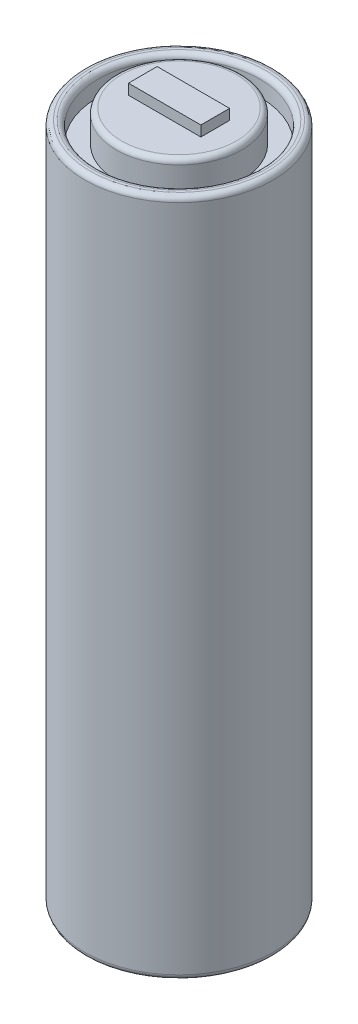
ISO-10303-21;
HEADER;
FILE_DESCRIPTION(('STEP AP214'),'2;1');
FILE_NAME('part.step','',(''),(''),'','','');
FILE_SCHEMA(('AUTOMOTIVE_DESIGN { 1 0 10303 214 1 1 1 1 }'));
ENDSEC;
DATA;
#1=APPLICATION_CONTEXT('core data for automotive mechanical design processes');
#2=APPLICATION_PROTOCOL_DEFINITION('international standard','automotive_design',2000,#1);
#3=PRODUCT_CONTEXT('',#1,'mechanical');
#4=PRODUCT('Part','Part','',(#3));
#5=PRODUCT_RELATED_PRODUCT_CATEGORY('part','',(#4));
#6=PRODUCT_DEFINITION_FORMATION('','',#4);
#7=PRODUCT_DEFINITION_CONTEXT('part definition',#1,'design');
#8=PRODUCT_DEFINITION('design','',#6,#7);
#9=PRODUCT_DEFINITION_SHAPE('','',#8);
#10=(LENGTH_UNIT() NAMED_UNIT(*) SI_UNIT(.MILLI.,.METRE.));
#11=(NAMED_UNIT(*) PLANE_ANGLE_UNIT() SI_UNIT($,.RADIAN.));
#12=(NAMED_UNIT(*) SI_UNIT($,.STERADIAN.) SOLID_ANGLE_UNIT());
#13=UNCERTAINTY_MEASURE_WITH_UNIT(LENGTH_MEASURE(1.E-05),#10,'distance_accuracy_value','');
#14=(GEOMETRIC_REPRESENTATION_CONTEXT(3) GLOBAL_UNCERTAINTY_ASSIGNED_CONTEXT((#13)) GLOBAL_UNIT_ASSIGNED_CONTEXT((#10,
#11,#12)) REPRESENTATION_CONTEXT('',''));
#15=CARTESIAN_POINT('',(0.,0.,0.));
#16=DIRECTION('',(0.,0.,1.));
#17=DIRECTION('',(1.,0.,0.));
#18=AXIS2_PLACEMENT_3D('',#15,#16,#17);
#19=CARTESIAN_POINT('',(0.,66.,0.));
#20=DIRECTION('',(0.,1.,0.));
#21=DIRECTION('',(0.,0.,1.));
#22=AXIS2_PLACEMENT_3D('',#19,#20,#21);
#23=PLANE('',#22);
#24=CARTESIAN_POINT('',(0.,66.,0.));
#25=DIRECTION('',(0.,1.,0.));
#26=DIRECTION('',(0.,0.,1.));
#27=AXIS2_PLACEMENT_3D('',#24,#25,#26);
#28=CIRCLE('',#27,5.5);
#29=CARTESIAN_POINT('',(0.,66.,5.5));
#30=VERTEX_POINT('',#29);
#31=EDGE_CURVE('E165',#30,#30,#28,.T.);
#32=ORIENTED_EDGE('',*,*,#31,.T.);
#33=EDGE_LOOP('',(#32));
#34=FACE_BOUND('',#33,.T.);
#35=DIRECTION('',(1.,0.,0.));
#36=VECTOR('',#35,1.);
#37=CARTESIAN_POINT('',(3.46645993403452,66.,1.37585131009472));
#38=LINE('',#37,#36);
#39=CARTESIAN_POINT('',(-3.46645993403452,66.,1.37585131009472));
#40=VERTEX_POINT('',#39);
#41=CARTESIAN_POINT('',(3.46645993403452,66.,1.37585131009472));
#42=VERTEX_POINT('',#41);
#43=EDGE_CURVE('E338',#40,#42,#38,.T.);
#44=ORIENTED_EDGE('',*,*,#43,.F.);
#45=DIRECTION('',(0.,0.,1.));
#46=VECTOR('',#45,1.);
#47=CARTESIAN_POINT('',(-3.46645993403452,66.,1.37585131009472));
#48=LINE('',#47,#46);
#49=CARTESIAN_POINT('',(-3.46645993403452,66.,-1.37585131009472));
#50=VERTEX_POINT('',#49);
#51=EDGE_CURVE('E123',#50,#40,#48,.T.);
#52=ORIENTED_EDGE('',*,*,#51,.F.);
#53=DIRECTION('',(-1.,0.,0.));
#54=VECTOR('',#53,1.);
#55=CARTESIAN_POINT('',(-3.46645993403452,66.,-1.37585131009472));
#56=LINE('',#55,#54);
#57=CARTESIAN_POINT('',(3.46645993403453,66.,-1.37585131009472));
#58=VERTEX_POINT('',#57);
#59=EDGE_CURVE('E119',#58,#50,#56,.T.);
#60=ORIENTED_EDGE('',*,*,#59,.F.);
#61=DIRECTION('',(0.,0.,-1.));
#62=VECTOR('',#61,1.);
#63=CARTESIAN_POINT('',(3.46645993403453,66.,-1.37585131009472));
#64=LINE('',#63,#62);
#65=EDGE_CURVE('E335',#42,#58,#64,.T.);
#66=ORIENTED_EDGE('',*,*,#65,.F.);
#67=EDGE_LOOP('',(#44,#52,#60,#66));
#68=FACE_BOUND('',#67,.T.);
#69=ADVANCED_FACE('F35',(#34,#68),#23,.T.);
#70=CARTESIAN_POINT('',(0.,0.,0.));
#71=DIRECTION('',(0.,1.,0.));
#72=DIRECTION('',(0.,0.,1.));
#73=AXIS2_PLACEMENT_3D('',#70,#71,#72);
#74=PLANE('',#73);
#75=CARTESIAN_POINT('',(0.,0.,0.));
#76=DIRECTION('',(0.,1.,0.));
#77=DIRECTION('',(0.,0.,1.));
#78=AXIS2_PLACEMENT_3D('',#75,#76,#77);
#79=CIRCLE('',#78,8.5);
#80=CARTESIAN_POINT('',(0.,0.,8.5));
#81=VERTEX_POINT('',#80);
#82=EDGE_CURVE('E43',#81,#81,#79,.F.);
#83=ORIENTED_EDGE('',*,*,#82,.T.);
#84=EDGE_LOOP('',(#83));
#85=FACE_BOUND('',#84,.T.);
#86=DIRECTION('',(0.,0.,-1.));
#87=VECTOR('',#86,1.);
#88=CARTESIAN_POINT('',(-3.46645993403452,0.,1.37585131009472));
#89=LINE('',#88,#87);
#90=CARTESIAN_POINT('',(-3.46645993403452,0.,1.37585131009472));
#91=VERTEX_POINT('',#90);
#92=CARTESIAN_POINT('',(-3.46645993403452,0.,-1.37585131009472));
#93=VERTEX_POINT('',#92);
#94=EDGE_CURVE('E125',#91,#93,#89,.T.);
#95=ORIENTED_EDGE('',*,*,#94,.F.);
#96=DIRECTION('',(-1.,0.,0.));
#97=VECTOR('',#96,1.);
#98=CARTESIAN_POINT('',(-3.46645993403452,0.,1.37585131009472));
#99=LINE('',#98,#97);
#100=CARTESIAN_POINT('',(3.46645993403452,0.,1.37585131009472));
#101=VERTEX_POINT('',#100);
#102=EDGE_CURVE('E136',#101,#91,#99,.T.);
#103=ORIENTED_EDGE('',*,*,#102,.F.);
#104=DIRECTION('',(0.,0.,1.));
#105=VECTOR('',#104,1.);
#106=CARTESIAN_POINT('',(3.46645993403452,0.,1.37585131009472));
#107=LINE('',#106,#105);
#108=CARTESIAN_POINT('',(3.46645993403453,0.,-1.37585131009472));
#109=VERTEX_POINT('',#108);
#110=EDGE_CURVE('E144',#109,#101,#107,.T.);
#111=ORIENTED_EDGE('',*,*,#110,.F.);
#112=DIRECTION('',(1.,0.,0.));
#113=VECTOR('',#112,1.);
#114=CARTESIAN_POINT('',(-3.46645993403452,0.,-1.37585131009472));
#115=LINE('',#114,#113);
#116=EDGE_CURVE('E58',#93,#109,#115,.T.);
#117=ORIENTED_EDGE('',*,*,#116,.F.);
#118=EDGE_LOOP('',(#95,#103,#111,#117));
#119=FACE_BOUND('',#118,.T.);
#120=ADVANCED_FACE('F185',(#85,#119),#74,.F.);
#121=CARTESIAN_POINT('',(0.,65.,0.));
#122=DIRECTION('',(0.,-1.,0.));
#123=DIRECTION('',(0.,0.,-1.));
#124=AXIS2_PLACEMENT_3D('',#121,#122,#123);
#125=CYLINDRICAL_SURFACE('',#124,9.);
#126=CARTESIAN_POINT('',(0.,64.5,0.));
#127=DIRECTION('',(0.,1.,0.));
#128=DIRECTION('',(0.,0.,1.));
#129=AXIS2_PLACEMENT_3D('',#126,#127,#128);
#130=CIRCLE('',#129,9.);
#131=CARTESIAN_POINT('',(0.,64.5,9.));
#132=VERTEX_POINT('',#131);
#133=EDGE_CURVE('E180',#132,#132,#130,.F.);
#134=ORIENTED_EDGE('',*,*,#133,.T.);
#135=EDGE_LOOP('',(#134));
#136=FACE_BOUND('',#135,.T.);
#137=CARTESIAN_POINT('',(0.,0.5,0.));
#138=DIRECTION('',(0.,1.,0.));
#139=DIRECTION('',(0.,0.,1.));
#140=AXIS2_PLACEMENT_3D('',#137,#138,#139);
#141=CIRCLE('',#140,9.);
#142=CARTESIAN_POINT('',(0.,0.5,9.));
#143=VERTEX_POINT('',#142);
#144=EDGE_CURVE('E177',#143,#143,#141,.T.);
#145=ORIENTED_EDGE('',*,*,#144,.T.);
#146=EDGE_LOOP('',(#145));
#147=FACE_BOUND('',#146,.T.);
#148=ADVANCED_FACE('F193',(#136,#147),#125,.T.);
#149=CARTESIAN_POINT('',(0.,65.,0.));
#150=DIRECTION('',(0.,1.,0.));
#151=DIRECTION('',(0.,0.,1.));
#152=AXIS2_PLACEMENT_3D('',#149,#150,#151);
#153=PLANE('',#152);
#154=CARTESIAN_POINT('',(0.,65.,0.));
#155=DIRECTION('',(0.,1.,0.));
#156=DIRECTION('',(0.,0.,1.));
#157=AXIS2_PLACEMENT_3D('',#154,#155,#156);
#158=CIRCLE('',#157,8.5);
#159=CARTESIAN_POINT('',(0.,65.,8.5));
#160=VERTEX_POINT('',#159);
#161=EDGE_CURVE('E174',#160,#160,#158,.T.);
#162=ORIENTED_EDGE('',*,*,#161,.T.);
#163=EDGE_LOOP('',(#162));
#164=FACE_BOUND('',#163,.T.);
#165=CARTESIAN_POINT('',(0.,65.,0.));
#166=DIRECTION('',(0.,1.,0.));
#167=DIRECTION('',(0.,0.,1.));
#168=AXIS2_PLACEMENT_3D('',#165,#166,#167);
#169=CIRCLE('',#168,8.25);
#170=CARTESIAN_POINT('',(0.,65.,8.25));
#171=VERTEX_POINT('',#170);
#172=EDGE_CURVE('E171',#171,#171,#169,.F.);
#173=ORIENTED_EDGE('',*,*,#172,.T.);
#174=EDGE_LOOP('',(#173));
#175=FACE_BOUND('',#174,.T.);
#176=ADVANCED_FACE('F195',(#164,#175),#153,.T.);
#177=CARTESIAN_POINT('',(0.,63.,0.));
#178=DIRECTION('',(0.,1.,0.));
#179=DIRECTION('',(0.,0.,1.));
#180=AXIS2_PLACEMENT_3D('',#177,#178,#179);
#181=CYLINDRICAL_SURFACE('',#180,7.75);
#182=CARTESIAN_POINT('',(0.,64.5,0.));
#183=DIRECTION('',(0.,1.,0.));
#184=DIRECTION('',(0.,0.,1.));
#185=AXIS2_PLACEMENT_3D('',#182,#183,#184);
#186=CIRCLE('',#185,7.75);
#187=CARTESIAN_POINT('',(0.,64.5,7.75));
#188=VERTEX_POINT('',#187);
#189=EDGE_CURVE('E11',#188,#188,#186,.T.);
#190=ORIENTED_EDGE('',*,*,#189,.T.);
#191=EDGE_LOOP('',(#190));
#192=FACE_BOUND('',#191,.T.);
#193=CARTESIAN_POINT('',(0.,63.,0.));
#194=DIRECTION('',(0.,1.,0.));
#195=DIRECTION('',(0.,0.,1.));
#196=AXIS2_PLACEMENT_3D('',#193,#194,#195);
#197=CIRCLE('',#196,7.75);
#198=CARTESIAN_POINT('',(0.,63.,7.75));
#199=VERTEX_POINT('',#198);
#200=EDGE_CURVE('E162',#199,#199,#197,.T.);
#201=ORIENTED_EDGE('',*,*,#200,.F.);
#202=EDGE_LOOP('',(#201));
#203=FACE_BOUND('',#202,.T.);
#204=ADVANCED_FACE('F202',(#192,#203),#181,.F.);
#205=CARTESIAN_POINT('',(0.,63.,0.));
#206=DIRECTION('',(0.,1.,0.));
#207=DIRECTION('',(0.,0.,1.));
#208=AXIS2_PLACEMENT_3D('',#205,#206,#207);
#209=PLANE('',#208);
#210=CARTESIAN_POINT('',(0.,63.,0.));
#211=DIRECTION('',(0.,1.,0.));
#212=DIRECTION('',(0.,0.,1.));
#213=AXIS2_PLACEMENT_3D('',#210,#211,#212);
#214=CIRCLE('',#213,6.);
#215=CARTESIAN_POINT('',(0.,63.,6.));
#216=VERTEX_POINT('',#215);
#217=EDGE_CURVE('E159',#216,#216,#214,.T.);
#218=ORIENTED_EDGE('',*,*,#217,.F.);
#219=EDGE_LOOP('',(#218));
#220=FACE_BOUND('',#219,.T.);
#221=ORIENTED_EDGE('',*,*,#200,.T.);
#222=EDGE_LOOP('',(#221));
#223=FACE_BOUND('',#222,.T.);
#224=ADVANCED_FACE('F221',(#220,#223),#209,.T.);
#225=CARTESIAN_POINT('',(0.,63.,0.));
#226=DIRECTION('',(0.,1.,0.));
#227=DIRECTION('',(0.,0.,1.));
#228=AXIS2_PLACEMENT_3D('',#225,#226,#227);
#229=CYLINDRICAL_SURFACE('',#228,6.);
#230=CARTESIAN_POINT('',(0.,65.5,0.));
#231=DIRECTION('',(0.,1.,0.));
#232=DIRECTION('',(0.,0.,1.));
#233=AXIS2_PLACEMENT_3D('',#230,#231,#232);
#234=CIRCLE('',#233,6.);
#235=CARTESIAN_POINT('',(0.,65.5,6.));
#236=VERTEX_POINT('',#235);
#237=EDGE_CURVE('E168',#236,#236,#234,.F.);
#238=ORIENTED_EDGE('',*,*,#237,.T.);
#239=EDGE_LOOP('',(#238));
#240=FACE_BOUND('',#239,.T.);
#241=ORIENTED_EDGE('',*,*,#217,.T.);
#242=EDGE_LOOP('',(#241));
#243=FACE_BOUND('',#242,.T.);
#244=ADVANCED_FACE('F217',(#240,#243),#229,.T.);
#245=CARTESIAN_POINT('',(0.,65.5,0.));
#246=DIRECTION('',(0.,1.,0.));
#247=DIRECTION('',(0.,0.,1.));
#248=AXIS2_PLACEMENT_3D('',#245,#246,#247);
#249=TOROIDAL_SURFACE('',#248,5.5,0.5);
#250=ORIENTED_EDGE('',*,*,#237,.F.);
#251=EDGE_LOOP('',(#250));
#252=FACE_BOUND('',#251,.T.);
#253=ORIENTED_EDGE('',*,*,#31,.F.);
#254=EDGE_LOOP('',(#253));
#255=FACE_BOUND('',#254,.T.);
#256=ADVANCED_FACE('F220',(#252,#255),#249,.T.);
#257=CARTESIAN_POINT('',(0.,64.5,0.));
#258=DIRECTION('',(0.,1.,0.));
#259=DIRECTION('',(0.,0.,1.));
#260=AXIS2_PLACEMENT_3D('',#257,#258,#259);
#261=TOROIDAL_SURFACE('',#260,8.5,0.5);
#262=ORIENTED_EDGE('',*,*,#133,.F.);
#263=EDGE_LOOP('',(#262));
#264=FACE_BOUND('',#263,.T.);
#265=ORIENTED_EDGE('',*,*,#161,.F.);
#266=EDGE_LOOP('',(#265));
#267=FACE_BOUND('',#266,.T.);
#268=ADVANCED_FACE('F190',(#264,#267),#261,.T.);
#269=CARTESIAN_POINT('',(0.,0.5,0.));
#270=DIRECTION('',(0.,1.,0.));
#271=DIRECTION('',(0.,0.,1.));
#272=AXIS2_PLACEMENT_3D('',#269,#270,#271);
#273=TOROIDAL_SURFACE('',#272,8.5,0.5);
#274=ORIENTED_EDGE('',*,*,#82,.F.);
#275=EDGE_LOOP('',(#274));
#276=FACE_BOUND('',#275,.T.);
#277=ORIENTED_EDGE('',*,*,#144,.F.);
#278=EDGE_LOOP('',(#277));
#279=FACE_BOUND('',#278,.T.);
#280=ADVANCED_FACE('F187',(#276,#279),#273,.T.);
#281=CARTESIAN_POINT('',(0.,64.5,0.));
#282=DIRECTION('',(0.,1.,0.));
#283=DIRECTION('',(0.,0.,1.));
#284=AXIS2_PLACEMENT_3D('',#281,#282,#283);
#285=TOROIDAL_SURFACE('',#284,8.25,0.5);
#286=ORIENTED_EDGE('',*,*,#172,.F.);
#287=EDGE_LOOP('',(#286));
#288=FACE_BOUND('',#287,.T.);
#289=ORIENTED_EDGE('',*,*,#189,.F.);
#290=EDGE_LOOP('',(#289));
#291=FACE_BOUND('',#290,.T.);
#292=ADVANCED_FACE('F37',(#288,#291),#285,.T.);
#293=CARTESIAN_POINT('',(-3.46645993403452,-1.,1.37585131009472));
#294=DIRECTION('',(1.,0.,0.));
#295=DIRECTION('',(0.,0.,-1.));
#296=AXIS2_PLACEMENT_3D('',#293,#294,#295);
#297=PLANE('',#296);
#298=ORIENTED_EDGE('',*,*,#94,.T.);
#299=DIRECTION('',(0.,1.,0.));
#300=VECTOR('',#299,1.);
#301=CARTESIAN_POINT('',(-3.46645993403452,-1.,-1.37585131009472));
#302=LINE('',#301,#300);
#303=CARTESIAN_POINT('',(-3.46645993403452,-1.,-1.37585131009472));
#304=VERTEX_POINT('',#303);
#305=EDGE_CURVE('E157',#304,#93,#302,.T.);
#306=ORIENTED_EDGE('',*,*,#305,.F.);
#307=DIRECTION('',(0.,0.,-1.));
#308=VECTOR('',#307,1.);
#309=CARTESIAN_POINT('',(-3.46645993403452,-1.,1.37585131009472));
#310=LINE('',#309,#308);
#311=CARTESIAN_POINT('',(-3.46645993403452,-1.,1.37585131009472));
#312=VERTEX_POINT('',#311);
#313=EDGE_CURVE('E132',#312,#304,#310,.T.);
#314=ORIENTED_EDGE('',*,*,#313,.F.);
#315=DIRECTION('',(0.,1.,0.));
#316=VECTOR('',#315,1.);
#317=CARTESIAN_POINT('',(-3.46645993403452,-1.,1.37585131009472));
#318=LINE('',#317,#316);
#319=EDGE_CURVE('E141',#312,#91,#318,.T.);
#320=ORIENTED_EDGE('',*,*,#319,.T.);
#321=EDGE_LOOP('',(#298,#306,#314,#320));
#322=FACE_BOUND('',#321,.T.);
#323=ADVANCED_FACE('F215',(#322),#297,.F.);
#324=CARTESIAN_POINT('',(-3.46645993403452,-1.,-1.37585131009472));
#325=DIRECTION('',(0.,0.,1.));
#326=DIRECTION('',(1.,0.,0.));
#327=AXIS2_PLACEMENT_3D('',#324,#325,#326);
#328=PLANE('',#327);
#329=ORIENTED_EDGE('',*,*,#116,.T.);
#330=DIRECTION('',(0.,1.,0.));
#331=VECTOR('',#330,1.);
#332=CARTESIAN_POINT('',(3.46645993403453,-1.,-1.37585131009472));
#333=LINE('',#332,#331);
#334=CARTESIAN_POINT('',(3.46645993403453,-1.,-1.37585131009472));
#335=VERTEX_POINT('',#334);
#336=EDGE_CURVE('E154',#335,#109,#333,.T.);
#337=ORIENTED_EDGE('',*,*,#336,.F.);
#338=DIRECTION('',(1.,0.,0.));
#339=VECTOR('',#338,1.);
#340=CARTESIAN_POINT('',(-3.46645993403452,-1.,-1.37585131009472));
#341=LINE('',#340,#339);
#342=EDGE_CURVE('E135',#304,#335,#341,.T.);
#343=ORIENTED_EDGE('',*,*,#342,.F.);
#344=ORIENTED_EDGE('',*,*,#305,.T.);
#345=EDGE_LOOP('',(#329,#337,#343,#344));
#346=FACE_BOUND('',#345,.T.);
#347=ADVANCED_FACE('F240',(#346),#328,.F.);
#348=CARTESIAN_POINT('',(3.46645993403452,-1.,1.37585131009472));
#349=DIRECTION('',(-1.,0.,0.));
#350=DIRECTION('',(0.,0.,1.));
#351=AXIS2_PLACEMENT_3D('',#348,#349,#350);
#352=PLANE('',#351);
#353=ORIENTED_EDGE('',*,*,#110,.T.);
#354=DIRECTION('',(0.,1.,0.));
#355=VECTOR('',#354,1.);
#356=CARTESIAN_POINT('',(3.46645993403452,-1.,1.37585131009472));
#357=LINE('',#356,#355);
#358=CARTESIAN_POINT('',(3.46645993403452,-1.,1.37585131009472));
#359=VERTEX_POINT('',#358);
#360=EDGE_CURVE('E151',#359,#101,#357,.T.);
#361=ORIENTED_EDGE('',*,*,#360,.F.);
#362=DIRECTION('',(0.,0.,1.));
#363=VECTOR('',#362,1.);
#364=CARTESIAN_POINT('',(3.46645993403452,-1.,1.37585131009472));
#365=LINE('',#364,#363);
#366=EDGE_CURVE('E138',#335,#359,#365,.T.);
#367=ORIENTED_EDGE('',*,*,#366,.F.);
#368=ORIENTED_EDGE('',*,*,#336,.T.);
#369=EDGE_LOOP('',(#353,#361,#367,#368));
#370=FACE_BOUND('',#369,.T.);
#371=ADVANCED_FACE('F247',(#370),#352,.F.);
#372=CARTESIAN_POINT('',(-3.46645993403452,-1.,1.37585131009472));
#373=DIRECTION('',(0.,0.,-1.));
#374=DIRECTION('',(-1.,0.,0.));
#375=AXIS2_PLACEMENT_3D('',#372,#373,#374);
#376=PLANE('',#375);
#377=ORIENTED_EDGE('',*,*,#102,.T.);
#378=ORIENTED_EDGE('',*,*,#319,.F.);
#379=DIRECTION('',(-1.,0.,0.));
#380=VECTOR('',#379,1.);
#381=CARTESIAN_POINT('',(-3.46645993403452,-1.,1.37585131009472));
#382=LINE('',#381,#380);
#383=EDGE_CURVE('E140',#359,#312,#382,.T.);
#384=ORIENTED_EDGE('',*,*,#383,.F.);
#385=ORIENTED_EDGE('',*,*,#360,.T.);
#386=EDGE_LOOP('',(#377,#378,#384,#385));
#387=FACE_BOUND('',#386,.T.);
#388=ADVANCED_FACE('F253',(#387),#376,.F.);
#389=CARTESIAN_POINT('',(0.,-1.,0.));
#390=DIRECTION('',(0.,-1.,0.));
#391=DIRECTION('',(0.,0.,-1.));
#392=AXIS2_PLACEMENT_3D('',#389,#390,#391);
#393=PLANE('',#392);
#394=ORIENTED_EDGE('',*,*,#313,.T.);
#395=ORIENTED_EDGE('',*,*,#342,.T.);
#396=ORIENTED_EDGE('',*,*,#366,.T.);
#397=ORIENTED_EDGE('',*,*,#383,.T.);
#398=EDGE_LOOP('',(#394,#395,#396,#397));
#399=FACE_BOUND('',#398,.T.);
#400=ADVANCED_FACE('F260',(#399),#393,.T.);
#401=CARTESIAN_POINT('',(-3.46645993403452,67.,1.37585131009472));
#402=DIRECTION('',(1.,0.,0.));
#403=DIRECTION('',(0.,0.,-1.));
#404=AXIS2_PLACEMENT_3D('',#401,#402,#403);
#405=PLANE('',#404);
#406=ORIENTED_EDGE('',*,*,#51,.T.);
#407=DIRECTION('',(0.,-1.,0.));
#408=VECTOR('',#407,1.);
#409=CARTESIAN_POINT('',(-3.46645993403452,67.,1.37585131009472));
#410=LINE('',#409,#408);
#411=CARTESIAN_POINT('',(-3.46645993403452,67.,1.37585131009472));
#412=VERTEX_POINT('',#411);
#413=EDGE_CURVE('E104',#412,#40,#410,.T.);
#414=ORIENTED_EDGE('',*,*,#413,.F.);
#415=DIRECTION('',(0.,0.,1.));
#416=VECTOR('',#415,1.);
#417=CARTESIAN_POINT('',(-3.46645993403452,67.,1.37585131009472));
#418=LINE('',#417,#416);
#419=CARTESIAN_POINT('',(-3.46645993403452,67.,-1.37585131009472));
#420=VERTEX_POINT('',#419);
#421=EDGE_CURVE('E111',#420,#412,#418,.T.);
#422=ORIENTED_EDGE('',*,*,#421,.F.);
#423=DIRECTION('',(0.,-1.,0.));
#424=VECTOR('',#423,1.);
#425=CARTESIAN_POINT('',(-3.46645993403452,67.,-1.37585131009472));
#426=LINE('',#425,#424);
#427=EDGE_CURVE('E333',#420,#50,#426,.T.);
#428=ORIENTED_EDGE('',*,*,#427,.T.);
#429=EDGE_LOOP('',(#406,#414,#422,#428));
#430=FACE_BOUND('',#429,.T.);
#431=ADVANCED_FACE('F121',(#430),#405,.F.);
#432=CARTESIAN_POINT('',(3.46645993403452,67.,1.37585131009472));
#433=DIRECTION('',(0.,0.,-1.));
#434=DIRECTION('',(-1.,0.,0.));
#435=AXIS2_PLACEMENT_3D('',#432,#433,#434);
#436=PLANE('',#435);
#437=ORIENTED_EDGE('',*,*,#43,.T.);
#438=DIRECTION('',(0.,-1.,0.));
#439=VECTOR('',#438,1.);
#440=CARTESIAN_POINT('',(3.46645993403452,67.,1.37585131009472));
#441=LINE('',#440,#439);
#442=CARTESIAN_POINT('',(3.46645993403452,67.,1.37585131009472));
#443=VERTEX_POINT('',#442);
#444=EDGE_CURVE('E107',#443,#42,#441,.T.);
#445=ORIENTED_EDGE('',*,*,#444,.F.);
#446=DIRECTION('',(1.,0.,0.));
#447=VECTOR('',#446,1.);
#448=CARTESIAN_POINT('',(3.46645993403452,67.,1.37585131009472));
#449=LINE('',#448,#447);
#450=EDGE_CURVE('E100',#412,#443,#449,.T.);
#451=ORIENTED_EDGE('',*,*,#450,.F.);
#452=ORIENTED_EDGE('',*,*,#413,.T.);
#453=EDGE_LOOP('',(#437,#445,#451,#452));
#454=FACE_BOUND('',#453,.T.);
#455=ADVANCED_FACE('F102',(#454),#436,.F.);
#456=CARTESIAN_POINT('',(3.46645993403453,67.,-1.37585131009472));
#457=DIRECTION('',(-1.,0.,0.));
#458=DIRECTION('',(0.,0.,1.));
#459=AXIS2_PLACEMENT_3D('',#456,#457,#458);
#460=PLANE('',#459);
#461=ORIENTED_EDGE('',*,*,#65,.T.);
#462=DIRECTION('',(0.,-1.,0.));
#463=VECTOR('',#462,1.);
#464=CARTESIAN_POINT('',(3.46645993403453,67.,-1.37585131009472));
#465=LINE('',#464,#463);
#466=CARTESIAN_POINT('',(3.46645993403453,67.,-1.37585131009472));
#467=VERTEX_POINT('',#466);
#468=EDGE_CURVE('E50',#467,#58,#465,.T.);
#469=ORIENTED_EDGE('',*,*,#468,.F.);
#470=DIRECTION('',(0.,0.,-1.));
#471=VECTOR('',#470,1.);
#472=CARTESIAN_POINT('',(3.46645993403453,67.,-1.37585131009472));
#473=LINE('',#472,#471);
#474=EDGE_CURVE('E110',#443,#467,#473,.T.);
#475=ORIENTED_EDGE('',*,*,#474,.F.);
#476=ORIENTED_EDGE('',*,*,#444,.T.);
#477=EDGE_LOOP('',(#461,#469,#475,#476));
#478=FACE_BOUND('',#477,.T.);
#479=ADVANCED_FACE('F303',(#478),#460,.F.);
#480=CARTESIAN_POINT('',(-3.46645993403452,67.,-1.37585131009472));
#481=DIRECTION('',(0.,0.,1.));
#482=DIRECTION('',(1.,0.,0.));
#483=AXIS2_PLACEMENT_3D('',#480,#481,#482);
#484=PLANE('',#483);
#485=ORIENTED_EDGE('',*,*,#59,.T.);
#486=ORIENTED_EDGE('',*,*,#427,.F.);
#487=DIRECTION('',(-1.,0.,0.));
#488=VECTOR('',#487,1.);
#489=CARTESIAN_POINT('',(-3.46645993403452,67.,-1.37585131009472));
#490=LINE('',#489,#488);
#491=EDGE_CURVE('E115',#467,#420,#490,.T.);
#492=ORIENTED_EDGE('',*,*,#491,.F.);
#493=ORIENTED_EDGE('',*,*,#468,.T.);
#494=EDGE_LOOP('',(#485,#486,#492,#493));
#495=FACE_BOUND('',#494,.T.);
#496=ADVANCED_FACE('F311',(#495),#484,.F.);
#497=CARTESIAN_POINT('',(0.,67.,0.));
#498=DIRECTION('',(0.,-1.,0.));
#499=DIRECTION('',(0.,0.,-1.));
#500=AXIS2_PLACEMENT_3D('',#497,#498,#499);
#501=PLANE('',#500);
#502=ORIENTED_EDGE('',*,*,#421,.T.);
#503=ORIENTED_EDGE('',*,*,#450,.T.);
#504=ORIENTED_EDGE('',*,*,#474,.T.);
#505=ORIENTED_EDGE('',*,*,#491,.T.);
#506=EDGE_LOOP('',(#502,#503,#504,#505));
#507=FACE_BOUND('',#506,.T.);
#508=ADVANCED_FACE('F114',(#507),#501,.F.);
#509=CLOSED_SHELL('',(#69,#120,#148,#176,#204,#224,#244,#256,#268,#280,#292,#323,#347,#371,#388,
#400,#431,#455,#479,#496,#508));
#510=MANIFOLD_SOLID_BREP('B2',#509);
#511=ADVANCED_BREP_SHAPE_REPRESENTATION('',(#18,#510),#14);
#512=SHAPE_DEFINITION_REPRESENTATION(#9,#511);
ENDSEC;
END-ISO-10303-21;
